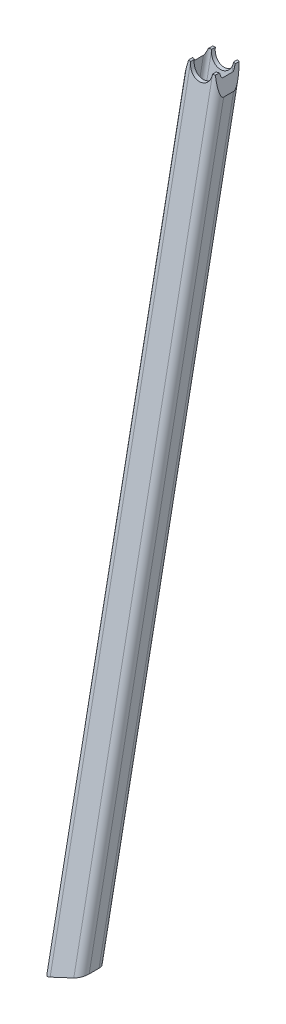
ISO-10303-21;
HEADER;
FILE_DESCRIPTION(('STEP AP214'),'2;1');
FILE_NAME('part.step','',(''),(''),'','','');
FILE_SCHEMA(('AUTOMOTIVE_DESIGN { 1 0 10303 214 1 1 1 1 }'));
ENDSEC;
DATA;
#1=APPLICATION_CONTEXT('core data for automotive mechanical design processes');
#2=APPLICATION_PROTOCOL_DEFINITION('international standard','automotive_design',2000,#1);
#3=PRODUCT_CONTEXT('',#1,'mechanical');
#4=PRODUCT('Part','Part','',(#3));
#5=PRODUCT_RELATED_PRODUCT_CATEGORY('part','',(#4));
#6=PRODUCT_DEFINITION_FORMATION('','',#4);
#7=PRODUCT_DEFINITION_CONTEXT('part definition',#1,'design');
#8=PRODUCT_DEFINITION('design','',#6,#7);
#9=PRODUCT_DEFINITION_SHAPE('','',#8);
#10=(LENGTH_UNIT() NAMED_UNIT(*) SI_UNIT(.MILLI.,.METRE.));
#11=(NAMED_UNIT(*) PLANE_ANGLE_UNIT() SI_UNIT($,.RADIAN.));
#12=(NAMED_UNIT(*) SI_UNIT($,.STERADIAN.) SOLID_ANGLE_UNIT());
#13=UNCERTAINTY_MEASURE_WITH_UNIT(LENGTH_MEASURE(1.E-05),#10,'distance_accuracy_value','');
#14=(GEOMETRIC_REPRESENTATION_CONTEXT(3) GLOBAL_UNCERTAINTY_ASSIGNED_CONTEXT((#13)) GLOBAL_UNIT_ASSIGNED_CONTEXT((#10,
#11,#12)) REPRESENTATION_CONTEXT('',''));
#15=CARTESIAN_POINT('',(0.,0.,0.));
#16=DIRECTION('',(0.,0.,1.));
#17=DIRECTION('',(1.,0.,0.));
#18=AXIS2_PLACEMENT_3D('',#15,#16,#17);
#19=CARTESIAN_POINT('',(0.,0.,0.));
#20=DIRECTION('',(0.,1.,0.));
#21=DIRECTION('',(0.,0.,1.));
#22=AXIS2_PLACEMENT_3D('',#19,#20,#21);
#23=PLANE('',#22);
#24=CARTESIAN_POINT('',(9.,0.,4.07486677982086));
#25=DIRECTION('',(0.,1.,0.));
#26=DIRECTION('',(0.,0.,-1.));
#27=AXIS2_PLACEMENT_3D('',#24,#25,#26);
#28=ELLIPSE('',#27,6.11230016973129,6.);
#29=CARTESIAN_POINT('',(8.99999999999999,0.,10.1871669495521));
#30=VERTEX_POINT('',#29);
#31=CARTESIAN_POINT('',(10.980762113533,0.,9.84449012342268));
#32=VERTEX_POINT('',#31);
#33=EDGE_CURVE('E248',#30,#32,#28,.T.);
#34=ORIENTED_EDGE('',*,*,#33,.T.);
#35=DIRECTION('',(0.,0.,-1.));
#36=VECTOR('',#35,1.);
#37=CARTESIAN_POINT('',(10.980762113533,0.,0.));
#38=LINE('',#37,#36);
#39=CARTESIAN_POINT('',(10.980762113533,0.,6.37016490933742));
#40=VERTEX_POINT('',#39);
#41=EDGE_CURVE('E215',#32,#40,#38,.T.);
#42=ORIENTED_EDGE('',*,*,#41,.T.);
#43=CARTESIAN_POINT('',(9.,0.,4.07486677982086));
#44=DIRECTION('',(0.,1.,0.));
#45=DIRECTION('',(0.,0.,-1.));
#46=AXIS2_PLACEMENT_3D('',#43,#44,#45);
#47=ELLIPSE('',#46,3.05615008486564,3.);
#48=CARTESIAN_POINT('',(9.00000000000002,0.,7.1310168646865));
#49=VERTEX_POINT('',#48);
#50=EDGE_CURVE('E201',#49,#40,#47,.T.);
#51=ORIENTED_EDGE('',*,*,#50,.F.);
#52=DIRECTION('',(0.,0.,1.));
#53=VECTOR('',#52,1.);
#54=CARTESIAN_POINT('',(9.,0.,-10.1871669495521));
#55=LINE('',#54,#53);
#56=EDGE_CURVE('E206',#30,#49,#55,.F.);
#57=ORIENTED_EDGE('',*,*,#56,.F.);
#58=EDGE_LOOP('',(#34,#42,#51,#57));
#59=FACE_BOUND('',#58,.T.);
#60=ADVANCED_FACE('F44',(#59),#23,.T.);
#61=CARTESIAN_POINT('',(-9.,0.,-4.07486677982086));
#62=DIRECTION('',(0.,1.,0.));
#63=DIRECTION('',(0.,0.,-1.));
#64=AXIS2_PLACEMENT_3D('',#61,#62,#63);
#65=ELLIPSE('',#64,6.11230016973129,6.);
#66=CARTESIAN_POINT('',(-9.,0.,-10.1871669495521));
#67=VERTEX_POINT('',#66);
#68=CARTESIAN_POINT('',(-10.980762113533,0.,-9.84449012342268));
#69=VERTEX_POINT('',#68);
#70=EDGE_CURVE('E255',#67,#69,#65,.T.);
#71=ORIENTED_EDGE('',*,*,#70,.T.);
#72=DIRECTION('',(0.,0.,1.));
#73=VECTOR('',#72,1.);
#74=CARTESIAN_POINT('',(-10.980762113533,0.,0.));
#75=LINE('',#74,#73);
#76=CARTESIAN_POINT('',(-10.980762113533,0.,-6.37016490933742));
#77=VERTEX_POINT('',#76);
#78=EDGE_CURVE('E287',#69,#77,#75,.T.);
#79=ORIENTED_EDGE('',*,*,#78,.T.);
#80=CARTESIAN_POINT('',(-9.,0.,-4.07486677982086));
#81=DIRECTION('',(0.,1.,0.));
#82=DIRECTION('',(0.,0.,-1.));
#83=AXIS2_PLACEMENT_3D('',#80,#81,#82);
#84=ELLIPSE('',#83,3.05615008486564,3.);
#85=CARTESIAN_POINT('',(-8.99999999999998,0.,-7.1310168646865));
#86=VERTEX_POINT('',#85);
#87=EDGE_CURVE('E319',#86,#77,#84,.T.);
#88=ORIENTED_EDGE('',*,*,#87,.F.);
#89=DIRECTION('',(0.,0.,1.));
#90=VECTOR('',#89,1.);
#91=CARTESIAN_POINT('',(-9.,0.,-10.1871669495521));
#92=LINE('',#91,#90);
#93=EDGE_CURVE('E225',#67,#86,#92,.T.);
#94=ORIENTED_EDGE('',*,*,#93,.F.);
#95=EDGE_LOOP('',(#71,#79,#88,#94));
#96=FACE_BOUND('',#95,.T.);
#97=ADVANCED_FACE('F344',(#96),#23,.T.);
#98=CARTESIAN_POINT('',(0.,0.,-10.1871669495521));
#99=DIRECTION('',(0.,0.,1.));
#100=DIRECTION('',(1.,0.,0.));
#101=AXIS2_PLACEMENT_3D('',#98,#99,#100);
#102=CYLINDRICAL_SURFACE('',#101,9.);
#103=CARTESIAN_POINT('',(0.,0.,-7.1310168646865));
#104=DIRECTION('',(0.,-0.190808995376545,-0.981627183447664));
#105=DIRECTION('',(0.,-0.981627183447664,0.190808995376545));
#106=AXIS2_PLACEMENT_3D('',#103,#104,#105);
#107=ELLIPSE('',#106,9.16845025459693,9.);
#108=CARTESIAN_POINT('',(9.,0.,-7.1310168646865));
#109=VERTEX_POINT('',#108);
#110=EDGE_CURVE('E200',#109,#86,#107,.T.);
#111=ORIENTED_EDGE('',*,*,#110,.F.);
#112=CARTESIAN_POINT('',(9.,0.,-10.1871669495521));
#113=VERTEX_POINT('',#112);
#114=EDGE_CURVE('E216',#109,#113,#55,.F.);
#115=ORIENTED_EDGE('',*,*,#114,.T.);
#116=CARTESIAN_POINT('',(0.,0.,-10.1871669495521));
#117=DIRECTION('',(0.,-0.190808995376545,-0.981627183447664));
#118=DIRECTION('',(0.,-0.981627183447664,0.190808995376545));
#119=AXIS2_PLACEMENT_3D('',#116,#117,#118);
#120=ELLIPSE('',#119,9.16845025459693,9.);
#121=EDGE_CURVE('E203',#113,#67,#120,.T.);
#122=ORIENTED_EDGE('',*,*,#121,.T.);
#123=ORIENTED_EDGE('',*,*,#93,.T.);
#124=EDGE_LOOP('',(#111,#115,#122,#123));
#125=FACE_BOUND('',#124,.T.);
#126=ADVANCED_FACE('F341',(#125),#102,.F.);
#127=CARTESIAN_POINT('',(-9.,0.,4.07486677982086));
#128=DIRECTION('',(0.,1.,0.));
#129=DIRECTION('',(0.,0.,1.));
#130=AXIS2_PLACEMENT_3D('',#127,#128,#129);
#131=ELLIPSE('',#130,3.05615008486564,3.);
#132=CARTESIAN_POINT('',(-10.980762113533,0.,6.37016490933742));
#133=VERTEX_POINT('',#132);
#134=CARTESIAN_POINT('',(-9.,0.,7.1310168646865));
#135=VERTEX_POINT('',#134);
#136=EDGE_CURVE('E211',#133,#135,#131,.T.);
#137=ORIENTED_EDGE('',*,*,#136,.F.);
#138=DIRECTION('',(0.,0.,1.));
#139=VECTOR('',#138,1.);
#140=CARTESIAN_POINT('',(-10.980762113533,0.,0.));
#141=LINE('',#140,#139);
#142=CARTESIAN_POINT('',(-10.980762113533,0.,9.84449012342268));
#143=VERTEX_POINT('',#142);
#144=EDGE_CURVE('E281',#133,#143,#141,.T.);
#145=ORIENTED_EDGE('',*,*,#144,.T.);
#146=CARTESIAN_POINT('',(-9.,0.,4.07486677982086));
#147=DIRECTION('',(0.,1.,0.));
#148=DIRECTION('',(0.,0.,1.));
#149=AXIS2_PLACEMENT_3D('',#146,#147,#148);
#150=ELLIPSE('',#149,6.11230016973129,6.);
#151=CARTESIAN_POINT('',(-8.99999999999995,0.,10.1871669495521));
#152=VERTEX_POINT('',#151);
#153=EDGE_CURVE('E249',#143,#152,#150,.T.);
#154=ORIENTED_EDGE('',*,*,#153,.T.);
#155=EDGE_CURVE('E220',#135,#152,#92,.T.);
#156=ORIENTED_EDGE('',*,*,#155,.F.);
#157=EDGE_LOOP('',(#137,#145,#154,#156));
#158=FACE_BOUND('',#157,.T.);
#159=ADVANCED_FACE('F372',(#158),#23,.T.);
#160=CARTESIAN_POINT('',(9.,0.,-4.07486677982086));
#161=DIRECTION('',(0.,1.,0.));
#162=DIRECTION('',(0.,0.,1.));
#163=AXIS2_PLACEMENT_3D('',#160,#161,#162);
#164=ELLIPSE('',#163,3.05615008486564,3.);
#165=CARTESIAN_POINT('',(10.980762113533,0.,-6.37016490933742));
#166=VERTEX_POINT('',#165);
#167=EDGE_CURVE('E214',#166,#109,#164,.T.);
#168=ORIENTED_EDGE('',*,*,#167,.F.);
#169=DIRECTION('',(0.,0.,-1.));
#170=VECTOR('',#169,1.);
#171=CARTESIAN_POINT('',(10.980762113533,0.,0.));
#172=LINE('',#171,#170);
#173=CARTESIAN_POINT('',(10.980762113533,0.,-9.84449012342268));
#174=VERTEX_POINT('',#173);
#175=EDGE_CURVE('E303',#166,#174,#172,.T.);
#176=ORIENTED_EDGE('',*,*,#175,.T.);
#177=CARTESIAN_POINT('',(9.,0.,-4.07486677982086));
#178=DIRECTION('',(0.,1.,0.));
#179=DIRECTION('',(0.,0.,1.));
#180=AXIS2_PLACEMENT_3D('',#177,#178,#179);
#181=ELLIPSE('',#180,6.11230016973129,6.);
#182=EDGE_CURVE('E254',#174,#113,#181,.T.);
#183=ORIENTED_EDGE('',*,*,#182,.T.);
#184=ORIENTED_EDGE('',*,*,#114,.F.);
#185=EDGE_LOOP('',(#168,#176,#183,#184));
#186=FACE_BOUND('',#185,.T.);
#187=ADVANCED_FACE('F313',(#186),#23,.T.);
#188=CARTESIAN_POINT('',(-15.,21.5406336227187,6.00009192694573));
#189=DIRECTION('',(-1.,0.,0.));
#190=DIRECTION('',(0.,0.,1.));
#191=AXIS2_PLACEMENT_3D('',#188,#189,#190);
#192=PLANE('',#191);
#193=DIRECTION('',(0.,0.981627183447664,-0.190808995376545));
#194=VECTOR('',#193,1.);
#195=CARTESIAN_POINT('',(-15.,-1.14485397225927,4.29740384886616));
#196=LINE('',#195,#194);
#197=CARTESIAN_POINT('',(-15.,-597.367122243144,120.191272670153));
#198=VERTEX_POINT('',#197);
#199=CARTESIAN_POINT('',(-15.,-15.,6.99057141688665));
#200=VERTEX_POINT('',#199);
#201=EDGE_CURVE('E257',#198,#200,#196,.T.);
#202=ORIENTED_EDGE('',*,*,#201,.T.);
#203=DIRECTION('',(0.,0.,-1.));
#204=VECTOR('',#203,1.);
#205=CARTESIAN_POINT('',(-15.,-15.,6.00009192694573));
#206=LINE('',#205,#204);
#207=CARTESIAN_POINT('',(-15.,-15.,-1.15916214275507));
#208=VERTEX_POINT('',#207);
#209=EDGE_CURVE('E278',#200,#208,#206,.T.);
#210=ORIENTED_EDGE('',*,*,#209,.T.);
#211=DIRECTION('',(0.,0.981627183447664,-0.190808995376545));
#212=VECTOR('',#211,1.);
#213=CARTESIAN_POINT('',(-15.,18.8693076874471,-7.74268864132156));
#214=LINE('',#213,#212);
#215=CARTESIAN_POINT('',(-15.,-597.367122243144,112.041539110511));
#216=VERTEX_POINT('',#215);
#217=EDGE_CURVE('E259',#208,#216,#214,.F.);
#218=ORIENTED_EDGE('',*,*,#217,.T.);
#219=DIRECTION('',(0.,0.,-1.));
#220=VECTOR('',#219,1.);
#221=CARTESIAN_POINT('',(-15.,-597.367122243144,6.00009192694573));
#222=LINE('',#221,#220);
#223=EDGE_CURVE('E231',#198,#216,#222,.T.);
#224=ORIENTED_EDGE('',*,*,#223,.F.);
#225=EDGE_LOOP('',(#202,#210,#218,#224));
#226=FACE_BOUND('',#225,.T.);
#227=ADVANCED_FACE('F359',(#226),#192,.T.);
#228=CARTESIAN_POINT('',(15.,21.5406336227187,6.00009192694573));
#229=DIRECTION('',(1.,0.,0.));
#230=DIRECTION('',(0.,0.,-1.));
#231=AXIS2_PLACEMENT_3D('',#228,#229,#230);
#232=PLANE('',#231);
#233=DIRECTION('',(0.,-0.981627183447664,0.190808995376545));
#234=VECTOR('',#233,1.);
#235=CARTESIAN_POINT('',(15.,18.8693076874471,-7.74268864132156));
#236=LINE('',#235,#234);
#237=CARTESIAN_POINT('',(15.,-584.632877756856,109.566252730631));
#238=VERTEX_POINT('',#237);
#239=CARTESIAN_POINT('',(15.,-15.,-1.15916214275507));
#240=VERTEX_POINT('',#239);
#241=EDGE_CURVE('E275',#238,#240,#236,.F.);
#242=ORIENTED_EDGE('',*,*,#241,.T.);
#243=DIRECTION('',(0.,0.,1.));
#244=VECTOR('',#243,1.);
#245=CARTESIAN_POINT('',(15.,-15.,6.00009192694573));
#246=LINE('',#245,#244);
#247=CARTESIAN_POINT('',(15.,-15.,6.99057141688665));
#248=VERTEX_POINT('',#247);
#249=EDGE_CURVE('E297',#240,#248,#246,.T.);
#250=ORIENTED_EDGE('',*,*,#249,.T.);
#251=DIRECTION('',(0.,-0.981627183447664,0.190808995376545));
#252=VECTOR('',#251,1.);
#253=CARTESIAN_POINT('',(15.,-585.777731729115,117.938523359318));
#254=LINE('',#253,#252);
#255=CARTESIAN_POINT('',(15.,-584.632877756856,117.715986290273));
#256=VERTEX_POINT('',#255);
#257=EDGE_CURVE('E269',#248,#256,#254,.T.);
#258=ORIENTED_EDGE('',*,*,#257,.T.);
#259=DIRECTION('',(0.,0.,1.));
#260=VECTOR('',#259,1.);
#261=CARTESIAN_POINT('',(15.,-584.632877756856,6.00009192694573));
#262=LINE('',#261,#260);
#263=EDGE_CURVE('E226',#238,#256,#262,.T.);
#264=ORIENTED_EDGE('',*,*,#263,.F.);
#265=EDGE_LOOP('',(#242,#250,#258,#264));
#266=FACE_BOUND('',#265,.T.);
#267=ADVANCED_FACE('F329',(#266),#232,.T.);
#268=CARTESIAN_POINT('',(0.,1.90808995376545,9.81627183447664));
#269=DIRECTION('',(0.,-0.190808995376545,-0.981627183447664));
#270=DIRECTION('',(0.,0.981627183447664,-0.190808995376545));
#271=AXIS2_PLACEMENT_3D('',#268,#269,#270);
#272=PLANE('',#271);
#273=DIRECTION('',(0.,-0.981627183447664,0.190808995376545));
#274=VECTOR('',#273,1.);
#275=CARTESIAN_POINT('',(9.,0.,10.1871669495521));
#276=LINE('',#275,#274);
#277=CARTESIAN_POINT('',(9.00000000000004,-587.179726654113,124.32334373598));
#278=VERTEX_POINT('',#277);
#279=EDGE_CURVE('E280',#278,#30,#276,.F.);
#280=ORIENTED_EDGE('',*,*,#279,.T.);
#281=CARTESIAN_POINT('',(0.,0.,10.1871669495521));
#282=DIRECTION('',(0.,-0.190808995376545,-0.981627183447664));
#283=DIRECTION('',(0.,-0.981627183447664,0.190808995376545));
#284=AXIS2_PLACEMENT_3D('',#281,#282,#283);
#285=ELLIPSE('',#284,9.16845025459693,9.);
#286=EDGE_CURVE('E217',#30,#152,#285,.T.);
#287=ORIENTED_EDGE('',*,*,#286,.T.);
#288=DIRECTION('',(0.,0.981627183447664,-0.190808995376545));
#289=VECTOR('',#288,1.);
#290=CARTESIAN_POINT('',(-9.,-597.367122243144,126.303572839884));
#291=LINE('',#290,#289);
#292=CARTESIAN_POINT('',(-8.99999999999995,-594.820273345886,125.808515563908));
#293=VERTEX_POINT('',#292);
#294=EDGE_CURVE('E274',#152,#293,#291,.F.);
#295=ORIENTED_EDGE('',*,*,#294,.T.);
#296=DIRECTION('',(0.917861332931189,0.38960902060187,-0.0757323218674354));
#297=VECTOR('',#296,1.);
#298=CARTESIAN_POINT('',(220.039323611802,-497.598848550994,106.910584957467));
#299=LINE('',#298,#297);
#300=EDGE_CURVE('E237',#293,#278,#299,.T.);
#301=ORIENTED_EDGE('',*,*,#300,.T.);
#302=EDGE_LOOP('',(#280,#287,#295,#301));
#303=FACE_BOUND('',#302,.T.);
#304=ADVANCED_FACE('F474',(#303),#272,.F.);
#305=CARTESIAN_POINT('',(0.,-1.90808995376545,-9.81627183447664));
#306=DIRECTION('',(0.,-0.190808995376545,-0.981627183447664));
#307=DIRECTION('',(0.,0.981627183447664,-0.190808995376545));
#308=AXIS2_PLACEMENT_3D('',#305,#306,#307);
#309=PLANE('',#308);
#310=ORIENTED_EDGE('',*,*,#121,.F.);
#311=DIRECTION('',(0.,-0.981627183447664,0.190808995376545));
#312=VECTOR('',#311,1.);
#313=CARTESIAN_POINT('',(9.,-1.90808995376545,-9.81627183447664));
#314=LINE('',#313,#312);
#315=CARTESIAN_POINT('',(9.00000000000001,-587.179726654113,103.949009836876));
#316=VERTEX_POINT('',#315);
#317=EDGE_CURVE('E244',#113,#316,#314,.T.);
#318=ORIENTED_EDGE('',*,*,#317,.T.);
#319=DIRECTION('',(0.917861332931189,0.38960902060187,-0.0757323218674354));
#320=VECTOR('',#319,1.);
#321=CARTESIAN_POINT('',(218.623067602039,-498.200013560444,86.6531056987427));
#322=LINE('',#321,#320);
#323=CARTESIAN_POINT('',(-8.99999999999995,-594.820273345886,105.434181664804));
#324=VERTEX_POINT('',#323);
#325=EDGE_CURVE('E236',#324,#316,#322,.T.);
#326=ORIENTED_EDGE('',*,*,#325,.F.);
#327=DIRECTION('',(0.,0.981627183447664,-0.190808995376545));
#328=VECTOR('',#327,1.);
#329=CARTESIAN_POINT('',(-9.,-1.90808995376545,-9.81627183447664));
#330=LINE('',#329,#328);
#331=EDGE_CURVE('E241',#324,#67,#330,.T.);
#332=ORIENTED_EDGE('',*,*,#331,.T.);
#333=EDGE_LOOP('',(#310,#318,#326,#332));
#334=FACE_BOUND('',#333,.T.);
#335=ADVANCED_FACE('F338',(#334),#309,.T.);
#336=CARTESIAN_POINT('',(212.564911000072,-500.771548470633,0.));
#337=DIRECTION('',(-0.390731128489275,0.92050485345244,0.));
#338=DIRECTION('',(-0.92050485345244,-0.390731128489275,0.));
#339=AXIS2_PLACEMENT_3D('',#336,#337,#338);
#340=PLANE('',#339);
#341=DIRECTION('',(0.,0.,-1.));
#342=VECTOR('',#341,1.);
#343=CARTESIAN_POINT('',(-12.,-596.093697794515,6.00009192694573));
#344=LINE('',#343,#342);
#345=CARTESIAN_POINT('',(-12.,-596.093697794515,119.943744032165));
#346=VERTEX_POINT('',#345);
#347=CARTESIAN_POINT('',(-12.,-596.093697794515,111.794010472523));
#348=VERTEX_POINT('',#347);
#349=EDGE_CURVE('E381',#346,#348,#344,.T.);
#350=ORIENTED_EDGE('',*,*,#349,.F.);
#351=CARTESIAN_POINT('',(-9.,-594.820273345886,119.696215394177));
#352=DIRECTION('',(-0.390731128489275,0.92050485345244,0.));
#353=DIRECTION('',(-0.82415415610844,-0.349832683942513,0.44540657854904));
#354=AXIS2_PLACEMENT_3D('',#351,#352,#353);
#355=ELLIPSE('',#354,3.32008035960187,3.);
#356=CARTESIAN_POINT('',(-8.99999999999995,-594.820273345886,122.752365479042));
#357=VERTEX_POINT('',#356);
#358=EDGE_CURVE('E399',#357,#346,#355,.F.);
#359=ORIENTED_EDGE('',*,*,#358,.F.);
#360=DIRECTION('',(0.917861332931189,0.38960902060187,-0.0757323218674354));
#361=VECTOR('',#360,1.);
#362=CARTESIAN_POINT('',(219.826885210338,-497.689023302412,103.871963068659));
#363=LINE('',#362,#361);
#364=CARTESIAN_POINT('',(9.00000000000004,-587.179726654113,121.267193651114));
#365=VERTEX_POINT('',#364);
#366=EDGE_CURVE('E387',#357,#365,#363,.T.);
#367=ORIENTED_EDGE('',*,*,#366,.T.);
#368=CARTESIAN_POINT('',(9.,-587.179726654113,118.211043566249));
#369=DIRECTION('',(-0.390731128489275,0.92050485345244,0.));
#370=DIRECTION('',(0.82415415610844,0.349832683942513,-0.44540657854904));
#371=AXIS2_PLACEMENT_3D('',#368,#369,#370);
#372=ELLIPSE('',#371,3.32008035960187,3.);
#373=CARTESIAN_POINT('',(12.,-585.906302205485,117.963514928261));
#374=VERTEX_POINT('',#373);
#375=EDGE_CURVE('E202',#374,#365,#372,.F.);
#376=ORIENTED_EDGE('',*,*,#375,.F.);
#377=DIRECTION('',(0.,0.,1.));
#378=VECTOR('',#377,1.);
#379=CARTESIAN_POINT('',(12.,-585.906302205485,6.00009192694573));
#380=LINE('',#379,#378);
#381=CARTESIAN_POINT('',(12.,-585.906302205485,109.813781368619));
#382=VERTEX_POINT('',#381);
#383=EDGE_CURVE('E196',#382,#374,#380,.T.);
#384=ORIENTED_EDGE('',*,*,#383,.F.);
#385=CARTESIAN_POINT('',(9.,-587.179726654113,110.061310006607));
#386=DIRECTION('',(-0.390731128489275,0.92050485345244,0.));
#387=DIRECTION('',(-0.82415415610844,-0.349832683942513,0.44540657854904));
#388=AXIS2_PLACEMENT_3D('',#385,#386,#387);
#389=ELLIPSE('',#388,3.32008035960187,3.);
#390=CARTESIAN_POINT('',(9.,-587.179726654113,107.005159921741));
#391=VERTEX_POINT('',#390);
#392=EDGE_CURVE('E388',#391,#382,#389,.F.);
#393=ORIENTED_EDGE('',*,*,#392,.F.);
#394=DIRECTION('',(0.917861332931189,0.38960902060187,-0.0757323218674354));
#395=VECTOR('',#394,1.);
#396=CARTESIAN_POINT('',(218.835506003504,-498.109838809026,89.6917275875514));
#397=LINE('',#396,#395);
#398=CARTESIAN_POINT('',(-8.99999999999995,-594.820273345886,108.490331749669));
#399=VERTEX_POINT('',#398);
#400=EDGE_CURVE('E393',#399,#391,#397,.T.);
#401=ORIENTED_EDGE('',*,*,#400,.F.);
#402=CARTESIAN_POINT('',(-9.,-594.820273345886,111.546481834535));
#403=DIRECTION('',(-0.390731128489275,0.92050485345244,0.));
#404=DIRECTION('',(0.82415415610844,0.349832683942513,-0.44540657854904));
#405=AXIS2_PLACEMENT_3D('',#402,#403,#404);
#406=ELLIPSE('',#405,3.32008035960187,3.);
#407=EDGE_CURVE('E390',#348,#399,#406,.F.);
#408=ORIENTED_EDGE('',*,*,#407,.F.);
#409=EDGE_LOOP('',(#350,#359,#367,#376,#384,#393,#401,#408));
#410=FACE_BOUND('',#409,.T.);
#411=ORIENTED_EDGE('',*,*,#223,.T.);
#412=CARTESIAN_POINT('',(-9.,-594.820273345886,111.546481834535));
#413=DIRECTION('',(-0.390731128489275,0.92050485345244,0.));
#414=DIRECTION('',(0.82415415610844,0.349832683942513,-0.44540657854904));
#415=AXIS2_PLACEMENT_3D('',#412,#413,#414);
#416=ELLIPSE('',#415,6.64016071920374,6.);
#417=EDGE_CURVE('E268',#216,#324,#416,.F.);
#418=ORIENTED_EDGE('',*,*,#417,.T.);
#419=ORIENTED_EDGE('',*,*,#325,.T.);
#420=CARTESIAN_POINT('',(9.,-587.179726654113,110.061310006607));
#421=DIRECTION('',(-0.390731128489275,0.92050485345244,0.));
#422=DIRECTION('',(-0.82415415610844,-0.349832683942513,0.44540657854904));
#423=AXIS2_PLACEMENT_3D('',#420,#421,#422);
#424=ELLIPSE('',#423,6.64016071920374,6.);
#425=EDGE_CURVE('E266',#316,#238,#424,.F.);
#426=ORIENTED_EDGE('',*,*,#425,.T.);
#427=ORIENTED_EDGE('',*,*,#263,.T.);
#428=CARTESIAN_POINT('',(9.,-587.179726654113,118.211043566249));
#429=DIRECTION('',(-0.390731128489275,0.92050485345244,0.));
#430=DIRECTION('',(0.82415415610844,0.349832683942513,-0.44540657854904));
#431=AXIS2_PLACEMENT_3D('',#428,#429,#430);
#432=ELLIPSE('',#431,6.64016071920374,6.);
#433=EDGE_CURVE('E264',#256,#278,#432,.F.);
#434=ORIENTED_EDGE('',*,*,#433,.T.);
#435=ORIENTED_EDGE('',*,*,#300,.F.);
#436=CARTESIAN_POINT('',(-9.,-594.820273345886,119.696215394177));
#437=DIRECTION('',(-0.390731128489275,0.92050485345244,0.));
#438=DIRECTION('',(-0.82415415610844,-0.349832683942513,0.44540657854904));
#439=AXIS2_PLACEMENT_3D('',#436,#437,#438);
#440=ELLIPSE('',#439,6.64016071920374,6.);
#441=EDGE_CURVE('E265',#293,#198,#440,.F.);
#442=ORIENTED_EDGE('',*,*,#441,.T.);
#443=EDGE_LOOP('',(#411,#418,#419,#426,#427,#434,#435,#442));
#444=FACE_BOUND('',#443,.T.);
#445=ADVANCED_FACE('F333',(#410,#444),#340,.F.);
#446=CARTESIAN_POINT('',(-9.,-0.763235981506181,-3.92650873379066));
#447=DIRECTION('',(0.,0.981627183447664,-0.190808995376545));
#448=DIRECTION('',(0.,0.190808995376545,0.981627183447664));
#449=AXIS2_PLACEMENT_3D('',#446,#447,#448);
#450=CYLINDRICAL_SURFACE('',#449,6.);
#451=ORIENTED_EDGE('',*,*,#217,.F.);
#452=CARTESIAN_POINT('',(-9.,7.39230484541259,-5.51178528091241));
#453=DIRECTION('',(0.965925826289066,-0.258819045102528,0.));
#454=DIRECTION('',(0.253732400734091,0.946942211066028,-0.197282329971788));
#455=AXIS2_PLACEMENT_3D('',#452,#453,#454);
#456=ELLIPSE('',#455,23.6161143678974,6.);
#457=EDGE_CURVE('E285',#208,#69,#456,.T.);
#458=ORIENTED_EDGE('',*,*,#457,.T.);
#459=ORIENTED_EDGE('',*,*,#70,.F.);
#460=ORIENTED_EDGE('',*,*,#331,.F.);
#461=ORIENTED_EDGE('',*,*,#417,.F.);
#462=EDGE_LOOP('',(#451,#458,#459,#460,#461));
#463=FACE_BOUND('',#462,.T.);
#464=ADVANCED_FACE('F349',(#463),#450,.T.);
#465=CARTESIAN_POINT('',(9.,-0.763235981506181,-3.92650873379066));
#466=DIRECTION('',(0.,-0.981627183447664,0.190808995376545));
#467=DIRECTION('',(0.,-0.190808995376545,-0.981627183447664));
#468=AXIS2_PLACEMENT_3D('',#465,#466,#467);
#469=CYLINDRICAL_SURFACE('',#468,6.);
#470=ORIENTED_EDGE('',*,*,#182,.F.);
#471=CARTESIAN_POINT('',(9.,7.39230484541259,-5.51178528091241));
#472=DIRECTION('',(-0.965925826289066,-0.258819045102528,0.));
#473=DIRECTION('',(0.253732400734091,-0.946942211066028,0.197282329971788));
#474=AXIS2_PLACEMENT_3D('',#471,#472,#473);
#475=ELLIPSE('',#474,23.6161143678974,6.);
#476=EDGE_CURVE('E12',#174,#240,#475,.T.);
#477=ORIENTED_EDGE('',*,*,#476,.T.);
#478=ORIENTED_EDGE('',*,*,#241,.F.);
#479=ORIENTED_EDGE('',*,*,#425,.F.);
#480=ORIENTED_EDGE('',*,*,#317,.F.);
#481=EDGE_LOOP('',(#470,#477,#478,#479,#480));
#482=FACE_BOUND('',#481,.T.);
#483=ADVANCED_FACE('F324',(#482),#469,.T.);
#484=CARTESIAN_POINT('',(9.,20.3957796504595,0.110328826259751));
#485=DIRECTION('',(0.,0.981627183447664,-0.190808995376545));
#486=DIRECTION('',(0.,0.190808995376545,0.981627183447664));
#487=AXIS2_PLACEMENT_3D('',#484,#485,#486);
#488=CYLINDRICAL_SURFACE('',#487,6.);
#489=ORIENTED_EDGE('',*,*,#257,.F.);
#490=CARTESIAN_POINT('',(9.,7.39230484541259,2.6379482787293));
#491=DIRECTION('',(-0.965925826289066,-0.258819045102528,0.));
#492=DIRECTION('',(-0.253732400734091,0.946942211066028,-0.197282329971788));
#493=AXIS2_PLACEMENT_3D('',#490,#491,#492);
#494=ELLIPSE('',#493,23.6161143678974,6.);
#495=EDGE_CURVE('E296',#248,#32,#494,.T.);
#496=ORIENTED_EDGE('',*,*,#495,.T.);
#497=ORIENTED_EDGE('',*,*,#33,.F.);
#498=ORIENTED_EDGE('',*,*,#279,.F.);
#499=ORIENTED_EDGE('',*,*,#433,.F.);
#500=EDGE_LOOP('',(#489,#496,#497,#498,#499));
#501=FACE_BOUND('',#500,.T.);
#502=ADVANCED_FACE('F455',(#501),#488,.T.);
#503=CARTESIAN_POINT('',(-9.,20.3957796504595,0.110328826259751));
#504=DIRECTION('',(0.,-0.981627183447664,0.190808995376545));
#505=DIRECTION('',(0.,-0.190808995376545,-0.981627183447664));
#506=AXIS2_PLACEMENT_3D('',#503,#504,#505);
#507=CYLINDRICAL_SURFACE('',#506,6.);
#508=ORIENTED_EDGE('',*,*,#153,.F.);
#509=CARTESIAN_POINT('',(-9.,7.39230484541259,2.6379482787293));
#510=DIRECTION('',(0.965925826289066,-0.258819045102528,0.));
#511=DIRECTION('',(-0.253732400734091,-0.946942211066028,0.197282329971788));
#512=AXIS2_PLACEMENT_3D('',#509,#510,#511);
#513=ELLIPSE('',#512,23.6161143678974,6.);
#514=EDGE_CURVE('E295',#143,#200,#513,.T.);
#515=ORIENTED_EDGE('',*,*,#514,.T.);
#516=ORIENTED_EDGE('',*,*,#201,.F.);
#517=ORIENTED_EDGE('',*,*,#441,.F.);
#518=ORIENTED_EDGE('',*,*,#294,.F.);
#519=EDGE_LOOP('',(#508,#515,#516,#517,#518));
#520=FACE_BOUND('',#519,.T.);
#521=ADVANCED_FACE('F361',(#520),#507,.T.);
#522=ORIENTED_EDGE('',*,*,#56,.T.);
#523=CARTESIAN_POINT('',(0.,0.,7.1310168646865));
#524=DIRECTION('',(0.,-0.190808995376545,-0.981627183447664));
#525=DIRECTION('',(0.,-0.981627183447664,0.190808995376545));
#526=AXIS2_PLACEMENT_3D('',#523,#524,#525);
#527=ELLIPSE('',#526,9.16845025459693,9.);
#528=EDGE_CURVE('E184',#49,#135,#527,.T.);
#529=ORIENTED_EDGE('',*,*,#528,.T.);
#530=ORIENTED_EDGE('',*,*,#155,.T.);
#531=ORIENTED_EDGE('',*,*,#286,.F.);
#532=EDGE_LOOP('',(#522,#529,#530,#531));
#533=FACE_BOUND('',#532,.T.);
#534=ADVANCED_FACE('F218',(#533),#102,.F.);
#535=CARTESIAN_POINT('',(-12.,21.5406336227187,6.00009192694573));
#536=DIRECTION('',(-1.,0.,0.));
#537=DIRECTION('',(0.,0.,1.));
#538=AXIS2_PLACEMENT_3D('',#535,#536,#537);
#539=PLANE('',#538);
#540=DIRECTION('',(0.,0.981627183447664,-0.190808995376545));
#541=VECTOR('',#540,1.);
#542=CARTESIAN_POINT('',(-12.,-0.763235981506181,-3.92650873379066));
#543=LINE('',#542,#541);
#544=CARTESIAN_POINT('',(-12.,-3.80384757729372,-3.33547371183374));
#545=VERTEX_POINT('',#544);
#546=EDGE_CURVE('E396',#545,#348,#543,.F.);
#547=ORIENTED_EDGE('',*,*,#546,.F.);
#548=DIRECTION('',(0.,0.,-1.));
#549=VECTOR('',#548,1.);
#550=CARTESIAN_POINT('',(-12.,-3.80384757729372,6.00009192694573));
#551=LINE('',#550,#549);
#552=CARTESIAN_POINT('',(-12.,-3.80384757729372,4.81425984780798));
#553=VERTEX_POINT('',#552);
#554=EDGE_CURVE('E288',#545,#553,#551,.F.);
#555=ORIENTED_EDGE('',*,*,#554,.T.);
#556=DIRECTION('',(0.,-0.981627183447664,0.190808995376545));
#557=VECTOR('',#556,1.);
#558=CARTESIAN_POINT('',(-12.,20.3957796504595,0.110328826259751));
#559=LINE('',#558,#557);
#560=EDGE_CURVE('E385',#346,#553,#559,.F.);
#561=ORIENTED_EDGE('',*,*,#560,.F.);
#562=ORIENTED_EDGE('',*,*,#349,.T.);
#563=EDGE_LOOP('',(#547,#555,#561,#562));
#564=FACE_BOUND('',#563,.T.);
#565=ADVANCED_FACE('F447',(#564),#539,.F.);
#566=CARTESIAN_POINT('',(12.,21.5406336227187,6.00009192694573));
#567=DIRECTION('',(1.,0.,0.));
#568=DIRECTION('',(0.,0.,-1.));
#569=AXIS2_PLACEMENT_3D('',#566,#567,#568);
#570=PLANE('',#569);
#571=DIRECTION('',(0.,0.981627183447664,-0.190808995376545));
#572=VECTOR('',#571,1.);
#573=CARTESIAN_POINT('',(12.,20.3957796504595,0.110328826259751));
#574=LINE('',#573,#572);
#575=CARTESIAN_POINT('',(12.,-3.80384757729372,4.81425984780797));
#576=VERTEX_POINT('',#575);
#577=EDGE_CURVE('E386',#576,#374,#574,.F.);
#578=ORIENTED_EDGE('',*,*,#577,.F.);
#579=DIRECTION('',(0.,0.,1.));
#580=VECTOR('',#579,1.);
#581=CARTESIAN_POINT('',(12.,-3.80384757729372,6.00009192694573));
#582=LINE('',#581,#580);
#583=CARTESIAN_POINT('',(12.,-3.80384757729372,-3.33547371183374));
#584=VERTEX_POINT('',#583);
#585=EDGE_CURVE('E62',#576,#584,#582,.F.);
#586=ORIENTED_EDGE('',*,*,#585,.T.);
#587=DIRECTION('',(0.,-0.981627183447664,0.190808995376545));
#588=VECTOR('',#587,1.);
#589=CARTESIAN_POINT('',(12.,-0.763235981506181,-3.92650873379066));
#590=LINE('',#589,#588);
#591=EDGE_CURVE('E308',#382,#584,#590,.F.);
#592=ORIENTED_EDGE('',*,*,#591,.F.);
#593=ORIENTED_EDGE('',*,*,#383,.T.);
#594=EDGE_LOOP('',(#578,#586,#592,#593));
#595=FACE_BOUND('',#594,.T.);
#596=ADVANCED_FACE('F413',(#595),#570,.F.);
#597=CARTESIAN_POINT('',(0.,1.33566296763582,6.87139028413365));
#598=DIRECTION('',(0.,-0.190808995376545,-0.981627183447664));
#599=DIRECTION('',(0.,0.981627183447664,-0.190808995376545));
#600=AXIS2_PLACEMENT_3D('',#597,#598,#599);
#601=PLANE('',#600);
#602=DIRECTION('',(0.,0.981627183447664,-0.190808995376545));
#603=VECTOR('',#602,1.);
#604=CARTESIAN_POINT('',(9.00000000000004,1.33566296763582,6.87139028413365));
#605=LINE('',#604,#603);
#606=EDGE_CURVE('E186',#365,#49,#605,.T.);
#607=ORIENTED_EDGE('',*,*,#606,.F.);
#608=ORIENTED_EDGE('',*,*,#366,.F.);
#609=DIRECTION('',(0.,0.981627183447664,-0.190808995376545));
#610=VECTOR('',#609,1.);
#611=CARTESIAN_POINT('',(-8.99999999999995,1.33566296763582,6.87139028413365));
#612=LINE('',#611,#610);
#613=EDGE_CURVE('E191',#135,#357,#612,.F.);
#614=ORIENTED_EDGE('',*,*,#613,.F.);
#615=ORIENTED_EDGE('',*,*,#528,.F.);
#616=EDGE_LOOP('',(#607,#608,#614,#615));
#617=FACE_BOUND('',#616,.T.);
#618=ADVANCED_FACE('F190',(#617),#601,.T.);
#619=CARTESIAN_POINT('',(0.,-1.33566296763582,-6.87139028413365));
#620=DIRECTION('',(0.,-0.190808995376545,-0.981627183447664));
#621=DIRECTION('',(0.,0.981627183447664,-0.190808995376545));
#622=AXIS2_PLACEMENT_3D('',#619,#620,#621);
#623=PLANE('',#622);
#624=ORIENTED_EDGE('',*,*,#110,.T.);
#625=DIRECTION('',(0.,0.981627183447664,-0.190808995376545));
#626=VECTOR('',#625,1.);
#627=CARTESIAN_POINT('',(-8.99999999999995,-1.33566296763582,-6.87139028413365));
#628=LINE('',#627,#626);
#629=EDGE_CURVE('E374',#399,#86,#628,.T.);
#630=ORIENTED_EDGE('',*,*,#629,.F.);
#631=ORIENTED_EDGE('',*,*,#400,.T.);
#632=DIRECTION('',(0.,0.981627183447664,-0.190808995376545));
#633=VECTOR('',#632,1.);
#634=CARTESIAN_POINT('',(9.,-1.33566296763582,-6.87139028413365));
#635=LINE('',#634,#633);
#636=EDGE_CURVE('E378',#109,#391,#635,.F.);
#637=ORIENTED_EDGE('',*,*,#636,.F.);
#638=EDGE_LOOP('',(#624,#630,#631,#637));
#639=FACE_BOUND('',#638,.T.);
#640=ADVANCED_FACE('F544',(#639),#623,.F.);
#641=CARTESIAN_POINT('',(-9.,-0.763235981506181,-3.92650873379066));
#642=DIRECTION('',(0.,0.981627183447664,-0.190808995376545));
#643=DIRECTION('',(0.,0.190808995376545,0.981627183447664));
#644=AXIS2_PLACEMENT_3D('',#641,#642,#643);
#645=CYLINDRICAL_SURFACE('',#644,3.);
#646=ORIENTED_EDGE('',*,*,#87,.T.);
#647=CARTESIAN_POINT('',(-9.,7.39230484541259,-5.51178528091241));
#648=DIRECTION('',(0.965925826289066,-0.258819045102528,0.));
#649=DIRECTION('',(0.253732400734091,0.946942211066028,-0.197282329971788));
#650=AXIS2_PLACEMENT_3D('',#647,#648,#649);
#651=ELLIPSE('',#650,11.8080571839487,3.);
#652=EDGE_CURVE('E289',#77,#545,#651,.F.);
#653=ORIENTED_EDGE('',*,*,#652,.T.);
#654=ORIENTED_EDGE('',*,*,#546,.T.);
#655=ORIENTED_EDGE('',*,*,#407,.T.);
#656=ORIENTED_EDGE('',*,*,#629,.T.);
#657=EDGE_LOOP('',(#646,#653,#654,#655,#656));
#658=FACE_BOUND('',#657,.T.);
#659=ADVANCED_FACE('F548',(#658),#645,.F.);
#660=CARTESIAN_POINT('',(9.,-0.763235981506181,-3.92650873379066));
#661=DIRECTION('',(0.,-0.981627183447664,0.190808995376545));
#662=DIRECTION('',(0.,-0.190808995376545,-0.981627183447664));
#663=AXIS2_PLACEMENT_3D('',#660,#661,#662);
#664=CYLINDRICAL_SURFACE('',#663,3.);
#665=ORIENTED_EDGE('',*,*,#591,.T.);
#666=CARTESIAN_POINT('',(9.,7.39230484541259,-5.51178528091241));
#667=DIRECTION('',(-0.965925826289066,-0.258819045102528,0.));
#668=DIRECTION('',(0.253732400734091,-0.946942211066028,0.197282329971788));
#669=AXIS2_PLACEMENT_3D('',#666,#667,#668);
#670=ELLIPSE('',#669,11.8080571839487,3.);
#671=EDGE_CURVE('E53',#584,#166,#670,.F.);
#672=ORIENTED_EDGE('',*,*,#671,.T.);
#673=ORIENTED_EDGE('',*,*,#167,.T.);
#674=ORIENTED_EDGE('',*,*,#636,.T.);
#675=ORIENTED_EDGE('',*,*,#392,.T.);
#676=EDGE_LOOP('',(#665,#672,#673,#674,#675));
#677=FACE_BOUND('',#676,.T.);
#678=ADVANCED_FACE('F306',(#677),#664,.F.);
#679=CARTESIAN_POINT('',(9.,20.3957796504595,0.110328826259751));
#680=DIRECTION('',(0.,0.981627183447664,-0.190808995376545));
#681=DIRECTION('',(0.,0.190808995376545,0.981627183447664));
#682=AXIS2_PLACEMENT_3D('',#679,#680,#681);
#683=CYLINDRICAL_SURFACE('',#682,3.);
#684=ORIENTED_EDGE('',*,*,#50,.T.);
#685=CARTESIAN_POINT('',(9.,7.39230484541259,2.6379482787293));
#686=DIRECTION('',(-0.965925826289066,-0.258819045102528,0.));
#687=DIRECTION('',(-0.253732400734091,0.946942211066028,-0.197282329971788));
#688=AXIS2_PLACEMENT_3D('',#685,#686,#687);
#689=ELLIPSE('',#688,11.8080571839487,3.);
#690=EDGE_CURVE('E70',#40,#576,#689,.F.);
#691=ORIENTED_EDGE('',*,*,#690,.T.);
#692=ORIENTED_EDGE('',*,*,#577,.T.);
#693=ORIENTED_EDGE('',*,*,#375,.T.);
#694=ORIENTED_EDGE('',*,*,#606,.T.);
#695=EDGE_LOOP('',(#684,#691,#692,#693,#694));
#696=FACE_BOUND('',#695,.T.);
#697=ADVANCED_FACE('F199',(#696),#683,.F.);
#698=CARTESIAN_POINT('',(-9.,20.3957796504595,0.110328826259751));
#699=DIRECTION('',(0.,-0.981627183447664,0.190808995376545));
#700=DIRECTION('',(0.,-0.190808995376545,-0.981627183447664));
#701=AXIS2_PLACEMENT_3D('',#698,#699,#700);
#702=CYLINDRICAL_SURFACE('',#701,3.);
#703=ORIENTED_EDGE('',*,*,#560,.T.);
#704=CARTESIAN_POINT('',(-9.,7.39230484541259,2.6379482787293));
#705=DIRECTION('',(0.965925826289066,-0.258819045102528,0.));
#706=DIRECTION('',(-0.253732400734091,-0.946942211066028,0.197282329971788));
#707=AXIS2_PLACEMENT_3D('',#704,#705,#706);
#708=ELLIPSE('',#707,11.8080571839487,3.);
#709=EDGE_CURVE('E294',#553,#133,#708,.F.);
#710=ORIENTED_EDGE('',*,*,#709,.T.);
#711=ORIENTED_EDGE('',*,*,#136,.T.);
#712=ORIENTED_EDGE('',*,*,#613,.T.);
#713=ORIENTED_EDGE('',*,*,#358,.T.);
#714=EDGE_LOOP('',(#703,#710,#711,#712,#713));
#715=FACE_BOUND('',#714,.T.);
#716=ADVANCED_FACE('F412',(#715),#702,.F.);
#717=CARTESIAN_POINT('',(-15.,-15.,6.00009192694573));
#718=DIRECTION('',(0.965925826289066,-0.258819045102528,0.));
#719=DIRECTION('',(0.,0.,-1.));
#720=AXIS2_PLACEMENT_3D('',#717,#718,#719);
#721=PLANE('',#720);
#722=ORIENTED_EDGE('',*,*,#652,.F.);
#723=ORIENTED_EDGE('',*,*,#78,.F.);
#724=ORIENTED_EDGE('',*,*,#457,.F.);
#725=ORIENTED_EDGE('',*,*,#209,.F.);
#726=ORIENTED_EDGE('',*,*,#514,.F.);
#727=ORIENTED_EDGE('',*,*,#144,.F.);
#728=ORIENTED_EDGE('',*,*,#709,.F.);
#729=ORIENTED_EDGE('',*,*,#554,.F.);
#730=EDGE_LOOP('',(#722,#723,#724,#725,#726,#727,#728,#729));
#731=FACE_BOUND('',#730,.T.);
#732=ADVANCED_FACE('F354',(#731),#721,.F.);
#733=CARTESIAN_POINT('',(15.,-15.,6.00009192694573));
#734=DIRECTION('',(-0.965925826289066,-0.258819045102528,0.));
#735=DIRECTION('',(0.,0.,1.));
#736=AXIS2_PLACEMENT_3D('',#733,#734,#735);
#737=PLANE('',#736);
#738=ORIENTED_EDGE('',*,*,#690,.F.);
#739=ORIENTED_EDGE('',*,*,#41,.F.);
#740=ORIENTED_EDGE('',*,*,#495,.F.);
#741=ORIENTED_EDGE('',*,*,#249,.F.);
#742=ORIENTED_EDGE('',*,*,#476,.F.);
#743=ORIENTED_EDGE('',*,*,#175,.F.);
#744=ORIENTED_EDGE('',*,*,#671,.F.);
#745=ORIENTED_EDGE('',*,*,#585,.F.);
#746=EDGE_LOOP('',(#738,#739,#740,#741,#742,#743,#744,#745));
#747=FACE_BOUND('',#746,.T.);
#748=ADVANCED_FACE('F48',(#747),#737,.F.);
#749=CLOSED_SHELL('',(#60,#97,#126,#159,#187,#227,#267,#304,#335,#445,#464,#483,#502,#521,#534,
#565,#596,#618,#640,#659,#678,#697,#716,#732,#748));
#750=MANIFOLD_SOLID_BREP('B2',#749);
#751=ADVANCED_BREP_SHAPE_REPRESENTATION('',(#18,#750),#14);
#752=SHAPE_DEFINITION_REPRESENTATION(#9,#751);
ENDSEC;
END-ISO-10303-21;
